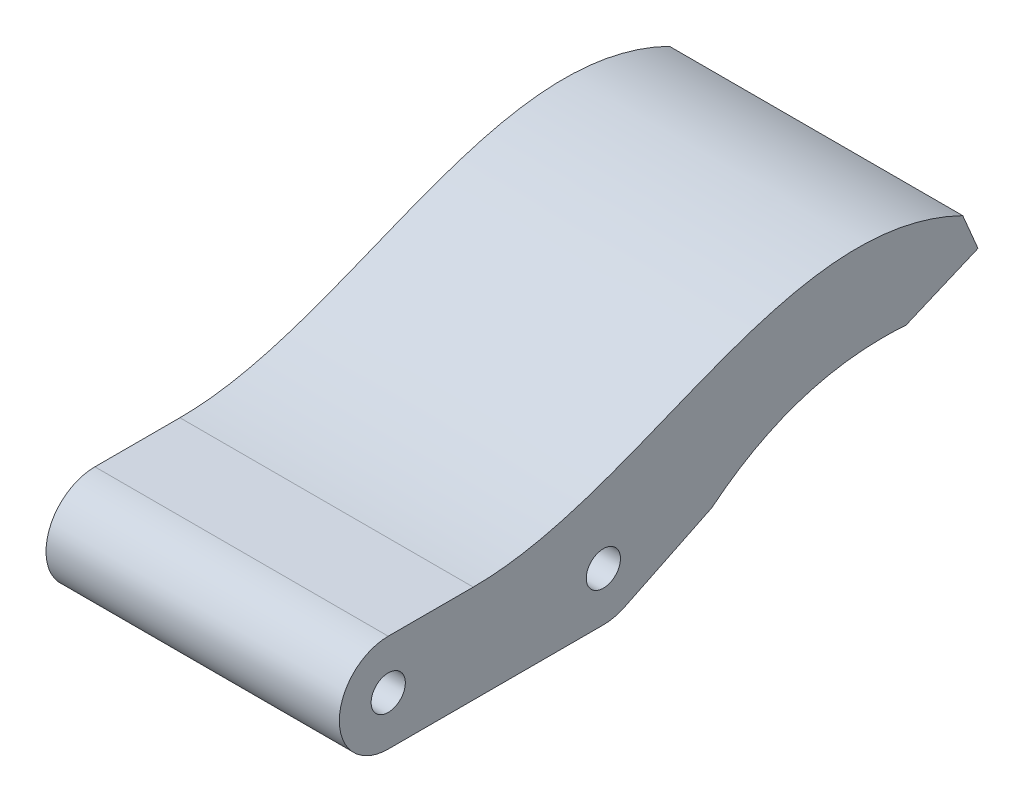
ISO-10303-21;
HEADER;
FILE_DESCRIPTION(('STEP AP214'),'2;1');
FILE_NAME('part.step','',(''),(''),'','','');
FILE_SCHEMA(('AUTOMOTIVE_DESIGN { 1 0 10303 214 1 1 1 1 }'));
ENDSEC;
DATA;
#1=APPLICATION_CONTEXT('core data for automotive mechanical design processes');
#2=APPLICATION_PROTOCOL_DEFINITION('international standard','automotive_design',2000,#1);
#3=PRODUCT_CONTEXT('',#1,'mechanical');
#4=PRODUCT('Part','Part','',(#3));
#5=PRODUCT_RELATED_PRODUCT_CATEGORY('part','',(#4));
#6=PRODUCT_DEFINITION_FORMATION('','',#4);
#7=PRODUCT_DEFINITION_CONTEXT('part definition',#1,'design');
#8=PRODUCT_DEFINITION('design','',#6,#7);
#9=PRODUCT_DEFINITION_SHAPE('','',#8);
#10=(LENGTH_UNIT() NAMED_UNIT(*) SI_UNIT(.MILLI.,.METRE.));
#11=(NAMED_UNIT(*) PLANE_ANGLE_UNIT() SI_UNIT($,.RADIAN.));
#12=(NAMED_UNIT(*) SI_UNIT($,.STERADIAN.) SOLID_ANGLE_UNIT());
#13=UNCERTAINTY_MEASURE_WITH_UNIT(LENGTH_MEASURE(1.E-05),#10,'distance_accuracy_value','');
#14=(GEOMETRIC_REPRESENTATION_CONTEXT(3) GLOBAL_UNCERTAINTY_ASSIGNED_CONTEXT((#13)) GLOBAL_UNIT_ASSIGNED_CONTEXT((#10,
#11,#12)) REPRESENTATION_CONTEXT('',''));
#15=CARTESIAN_POINT('',(0.,0.,0.));
#16=DIRECTION('',(0.,0.,1.));
#17=DIRECTION('',(1.,0.,0.));
#18=AXIS2_PLACEMENT_3D('',#15,#16,#17);
#19=CARTESIAN_POINT('',(30.,5.,-27.));
#20=DIRECTION('',(-1.,0.,0.));
#21=DIRECTION('',(0.,0.,1.));
#22=AXIS2_PLACEMENT_3D('',#19,#20,#21);
#23=CYLINDRICAL_SURFACE('',#22,5.);
#24=DIRECTION('',(1.,0.,0.));
#25=VECTOR('',#24,1.);
#26=CARTESIAN_POINT('',(-56.0007840593189,0.502127655445501,-29.1838370754458));
#27=LINE('',#26,#25);
#28=CARTESIAN_POINT('',(0.,0.502127655445501,-29.1838370754458));
#29=VERTEX_POINT('',#28);
#30=CARTESIAN_POINT('',(30.,0.502127655445501,-29.1838370754458));
#31=VERTEX_POINT('',#30);
#32=EDGE_CURVE('E170',#29,#31,#27,.T.);
#33=ORIENTED_EDGE('',*,*,#32,.T.);
#34=CARTESIAN_POINT('',(30.,5.,-27.));
#35=DIRECTION('',(1.,0.,0.));
#36=DIRECTION('',(0.,0.,-1.));
#37=AXIS2_PLACEMENT_3D('',#34,#35,#36);
#38=CIRCLE('',#37,5.);
#39=CARTESIAN_POINT('',(30.,0.,-27.));
#40=VERTEX_POINT('',#39);
#41=EDGE_CURVE('E188',#40,#31,#38,.T.);
#42=ORIENTED_EDGE('',*,*,#41,.F.);
#43=DIRECTION('',(-1.,0.,0.));
#44=VECTOR('',#43,1.);
#45=CARTESIAN_POINT('',(30.,0.,-27.));
#46=LINE('',#45,#44);
#47=CARTESIAN_POINT('',(0.,0.,-27.));
#48=VERTEX_POINT('',#47);
#49=EDGE_CURVE('E196',#40,#48,#46,.T.);
#50=ORIENTED_EDGE('',*,*,#49,.T.);
#51=CARTESIAN_POINT('',(0.,5.,-27.));
#52=DIRECTION('',(1.,0.,0.));
#53=DIRECTION('',(0.,0.,-1.));
#54=AXIS2_PLACEMENT_3D('',#51,#52,#53);
#55=CIRCLE('',#54,5.);
#56=EDGE_CURVE('E201',#48,#29,#55,.T.);
#57=ORIENTED_EDGE('',*,*,#56,.T.);
#58=EDGE_LOOP('',(#33,#42,#50,#57));
#59=FACE_BOUND('',#58,.T.);
#60=ADVANCED_FACE('F37',(#59),#23,.T.);
#61=CARTESIAN_POINT('',(30.,10.,0.));
#62=DIRECTION('',(0.,1.,0.));
#63=DIRECTION('',(0.,0.,1.));
#64=AXIS2_PLACEMENT_3D('',#61,#62,#63);
#65=PLANE('',#64);
#66=DIRECTION('',(1.,0.,0.));
#67=VECTOR('',#66,1.);
#68=CARTESIAN_POINT('',(-56.0007840593189,10.,-13.6949747586838));
#69=LINE('',#68,#67);
#70=CARTESIAN_POINT('',(0.,10.,-13.6949747586838));
#71=VERTEX_POINT('',#70);
#72=CARTESIAN_POINT('',(30.,10.,-13.6949747586838));
#73=VERTEX_POINT('',#72);
#74=EDGE_CURVE('E127',#71,#73,#69,.T.);
#75=ORIENTED_EDGE('',*,*,#74,.F.);
#76=DIRECTION('',(0.,0.,-1.));
#77=VECTOR('',#76,1.);
#78=CARTESIAN_POINT('',(0.,10.,0.));
#79=LINE('',#78,#77);
#80=CARTESIAN_POINT('',(0.,10.,-5.));
#81=VERTEX_POINT('',#80);
#82=EDGE_CURVE('E178',#81,#71,#79,.T.);
#83=ORIENTED_EDGE('',*,*,#82,.F.);
#84=DIRECTION('',(-1.,0.,0.));
#85=VECTOR('',#84,1.);
#86=CARTESIAN_POINT('',(30.,10.,-5.));
#87=LINE('',#86,#85);
#88=CARTESIAN_POINT('',(30.,10.,-5.));
#89=VERTEX_POINT('',#88);
#90=EDGE_CURVE('E11',#89,#81,#87,.T.);
#91=ORIENTED_EDGE('',*,*,#90,.F.);
#92=DIRECTION('',(0.,0.,-1.));
#93=VECTOR('',#92,1.);
#94=CARTESIAN_POINT('',(30.,10.,0.));
#95=LINE('',#94,#93);
#96=EDGE_CURVE('E179',#89,#73,#95,.T.);
#97=ORIENTED_EDGE('',*,*,#96,.T.);
#98=EDGE_LOOP('',(#75,#83,#91,#97));
#99=FACE_BOUND('',#98,.T.);
#100=ADVANCED_FACE('F39',(#99),#65,.T.);
#101=CARTESIAN_POINT('',(30.,5.,-5.));
#102=DIRECTION('',(-1.,0.,0.));
#103=DIRECTION('',(0.,0.,1.));
#104=AXIS2_PLACEMENT_3D('',#101,#102,#103);
#105=CYLINDRICAL_SURFACE('',#104,5.);
#106=CARTESIAN_POINT('',(0.,5.,-5.));
#107=DIRECTION('',(1.,0.,0.));
#108=DIRECTION('',(0.,0.,-1.));
#109=AXIS2_PLACEMENT_3D('',#106,#107,#108);
#110=CIRCLE('',#109,5.);
#111=CARTESIAN_POINT('',(0.,0.,-5.));
#112=VERTEX_POINT('',#111);
#113=EDGE_CURVE('E67',#81,#112,#110,.T.);
#114=ORIENTED_EDGE('',*,*,#113,.T.);
#115=DIRECTION('',(-1.,0.,0.));
#116=VECTOR('',#115,1.);
#117=CARTESIAN_POINT('',(30.,0.,-5.));
#118=LINE('',#117,#116);
#119=CARTESIAN_POINT('',(30.,0.,-5.));
#120=VERTEX_POINT('',#119);
#121=EDGE_CURVE('E46',#120,#112,#118,.T.);
#122=ORIENTED_EDGE('',*,*,#121,.F.);
#123=CARTESIAN_POINT('',(30.,5.,-5.));
#124=DIRECTION('',(1.,0.,0.));
#125=DIRECTION('',(0.,0.,-1.));
#126=AXIS2_PLACEMENT_3D('',#123,#124,#125);
#127=CIRCLE('',#126,5.);
#128=EDGE_CURVE('E184',#89,#120,#127,.T.);
#129=ORIENTED_EDGE('',*,*,#128,.F.);
#130=ORIENTED_EDGE('',*,*,#90,.T.);
#131=EDGE_LOOP('',(#114,#122,#129,#130));
#132=FACE_BOUND('',#131,.T.);
#133=ADVANCED_FACE('F265',(#132),#105,.T.);
#134=CARTESIAN_POINT('',(30.,0.,0.));
#135=DIRECTION('',(0.,1.,0.));
#136=DIRECTION('',(0.,0.,1.));
#137=AXIS2_PLACEMENT_3D('',#134,#135,#136);
#138=PLANE('',#137);
#139=DIRECTION('',(0.,0.,-1.));
#140=VECTOR('',#139,1.);
#141=CARTESIAN_POINT('',(0.,0.,0.));
#142=LINE('',#141,#140);
#143=EDGE_CURVE('E72',#112,#48,#142,.T.);
#144=ORIENTED_EDGE('',*,*,#143,.T.);
#145=ORIENTED_EDGE('',*,*,#49,.F.);
#146=DIRECTION('',(0.,0.,-1.));
#147=VECTOR('',#146,1.);
#148=CARTESIAN_POINT('',(30.,0.,0.));
#149=LINE('',#148,#147);
#150=EDGE_CURVE('E54',#120,#40,#149,.T.);
#151=ORIENTED_EDGE('',*,*,#150,.F.);
#152=ORIENTED_EDGE('',*,*,#121,.T.);
#153=EDGE_LOOP('',(#144,#145,#151,#152));
#154=FACE_BOUND('',#153,.T.);
#155=ADVANCED_FACE('F209',(#154),#138,.F.);
#156=CARTESIAN_POINT('',(30.,5.,-5.));
#157=DIRECTION('',(-1.,0.,0.));
#158=DIRECTION('',(0.,0.,1.));
#159=AXIS2_PLACEMENT_3D('',#156,#157,#158);
#160=CYLINDRICAL_SURFACE('',#159,1.75);
#161=CARTESIAN_POINT('',(30.,5.,-5.));
#162=DIRECTION('',(1.,0.,0.));
#163=DIRECTION('',(0.,0.,-1.));
#164=AXIS2_PLACEMENT_3D('',#161,#162,#163);
#165=CIRCLE('',#164,1.75);
#166=CARTESIAN_POINT('',(30.,5.,-6.75));
#167=VERTEX_POINT('',#166);
#168=EDGE_CURVE('E190',#167,#167,#165,.T.);
#169=ORIENTED_EDGE('',*,*,#168,.T.);
#170=EDGE_LOOP('',(#169));
#171=FACE_BOUND('',#170,.T.);
#172=CARTESIAN_POINT('',(0.,5.,-5.));
#173=DIRECTION('',(1.,0.,0.));
#174=DIRECTION('',(0.,0.,-1.));
#175=AXIS2_PLACEMENT_3D('',#172,#173,#174);
#176=CIRCLE('',#175,1.75);
#177=CARTESIAN_POINT('',(0.,5.,-6.75));
#178=VERTEX_POINT('',#177);
#179=EDGE_CURVE('E204',#178,#178,#176,.T.);
#180=ORIENTED_EDGE('',*,*,#179,.F.);
#181=EDGE_LOOP('',(#180));
#182=FACE_BOUND('',#181,.T.);
#183=ADVANCED_FACE('F257',(#171,#182),#160,.F.);
#184=CARTESIAN_POINT('',(30.,5.,-27.));
#185=DIRECTION('',(-1.,0.,0.));
#186=DIRECTION('',(0.,0.,1.));
#187=AXIS2_PLACEMENT_3D('',#184,#185,#186);
#188=CYLINDRICAL_SURFACE('',#187,1.75);
#189=CARTESIAN_POINT('',(30.,5.,-27.));
#190=DIRECTION('',(1.,0.,0.));
#191=DIRECTION('',(0.,0.,-1.));
#192=AXIS2_PLACEMENT_3D('',#189,#190,#191);
#193=CIRCLE('',#192,1.75);
#194=CARTESIAN_POINT('',(30.,5.,-28.75));
#195=VERTEX_POINT('',#194);
#196=EDGE_CURVE('E193',#195,#195,#193,.T.);
#197=ORIENTED_EDGE('',*,*,#196,.T.);
#198=EDGE_LOOP('',(#197));
#199=FACE_BOUND('',#198,.T.);
#200=CARTESIAN_POINT('',(0.,5.,-27.));
#201=DIRECTION('',(1.,0.,0.));
#202=DIRECTION('',(0.,0.,-1.));
#203=AXIS2_PLACEMENT_3D('',#200,#201,#202);
#204=CIRCLE('',#203,1.75);
#205=CARTESIAN_POINT('',(0.,5.,-28.75));
#206=VERTEX_POINT('',#205);
#207=EDGE_CURVE('E185',#206,#206,#204,.T.);
#208=ORIENTED_EDGE('',*,*,#207,.F.);
#209=EDGE_LOOP('',(#208));
#210=FACE_BOUND('',#209,.T.);
#211=ADVANCED_FACE('F252',(#199,#210),#188,.F.);
#212=CARTESIAN_POINT('',(30.,0.,0.));
#213=DIRECTION('',(1.,0.,0.));
#214=DIRECTION('',(0.,0.,-1.));
#215=AXIS2_PLACEMENT_3D('',#212,#213,#214);
#216=PLANE('',#215);
#217=ORIENTED_EDGE('',*,*,#96,.F.);
#218=ORIENTED_EDGE('',*,*,#128,.T.);
#219=ORIENTED_EDGE('',*,*,#150,.T.);
#220=ORIENTED_EDGE('',*,*,#41,.T.);
#221=DIRECTION('',(0.,0.436767415089167,-0.8995744689109));
#222=VECTOR('',#221,1.);
#223=CARTESIAN_POINT('',(30.,-11.0601312365663,-5.36998891997289));
#224=LINE('',#223,#222);
#225=CARTESIAN_POINT('',(30.,4.82408407678908,-38.0854206599091));
#226=VERTEX_POINT('',#225);
#227=EDGE_CURVE('E135',#31,#226,#224,.T.);
#228=ORIENTED_EDGE('',*,*,#227,.T.);
#229=CARTESIAN_POINT('',(30.,4.82408407678908,-38.0854206599091));
#230=CARTESIAN_POINT('',(30.,11.8952224566425,-46.7975095094647));
#231=CARTESIAN_POINT('',(30.,11.0678436667493,-57.9480004086976));
#232=B_SPLINE_CURVE_WITH_KNOTS('',2,(#229,#230,#231),.UNSPECIFIED.,.F.,.F.,(3,3),(0.,1.),.UNSPECIFIED.);
#233=CARTESIAN_POINT('',(30.,11.0678436667493,-57.9480004086976));
#234=VERTEX_POINT('',#233);
#235=EDGE_CURVE('E155',#226,#234,#232,.T.);
#236=ORIENTED_EDGE('',*,*,#235,.T.);
#237=DIRECTION('',(0.,0.39020935118337,-0.920726160293631));
#238=VECTOR('',#237,1.);
#239=CARTESIAN_POINT('',(30.,-11.4367064909869,-4.84694582599828));
#240=LINE('',#239,#238);
#241=CARTESIAN_POINT('',(30.,14.1895184762162,-65.3138096910467));
#242=VERTEX_POINT('',#241);
#243=EDGE_CURVE('E128',#234,#242,#240,.T.);
#244=ORIENTED_EDGE('',*,*,#243,.T.);
#245=DIRECTION('',(0.,0.920726160293631,0.39020935118337));
#246=VECTOR('',#245,1.);
#247=CARTESIAN_POINT('',(30.,25.6262249672031,-60.4668638650484));
#248=LINE('',#247,#246);
#249=CARTESIAN_POINT('',(30.,17.8724231173908,-63.7529722863132));
#250=VERTEX_POINT('',#249);
#251=EDGE_CURVE('E123',#242,#250,#248,.T.);
#252=ORIENTED_EDGE('',*,*,#251,.T.);
#253=CARTESIAN_POINT('',(30.,17.8724231173908,-63.7529722863132));
#254=CARTESIAN_POINT('',(30.,26.563787962677,-45.9288826779558));
#255=CARTESIAN_POINT('',(30.,10.,-31.059268620705));
#256=CARTESIAN_POINT('',(30.,10.,-13.6949747586838));
#257=B_SPLINE_CURVE_WITH_KNOTS('',3,(#253,#254,#255,#256),.UNSPECIFIED.,.F.,.F.,(4,4),(0.,1.),.UNSPECIFIED.);
#258=EDGE_CURVE('E131',#250,#73,#257,.T.);
#259=ORIENTED_EDGE('',*,*,#258,.T.);
#260=EDGE_LOOP('',(#217,#218,#219,#220,#228,#236,#244,#252,#259));
#261=FACE_BOUND('',#260,.T.);
#262=ORIENTED_EDGE('',*,*,#168,.F.);
#263=EDGE_LOOP('',(#262));
#264=FACE_BOUND('',#263,.T.);
#265=ORIENTED_EDGE('',*,*,#196,.F.);
#266=EDGE_LOOP('',(#265));
#267=FACE_BOUND('',#266,.T.);
#268=ADVANCED_FACE('F137',(#261,#264,#267),#216,.T.);
#269=CARTESIAN_POINT('',(0.,0.,0.));
#270=DIRECTION('',(1.,0.,0.));
#271=DIRECTION('',(0.,0.,-1.));
#272=AXIS2_PLACEMENT_3D('',#269,#270,#271);
#273=PLANE('',#272);
#274=DIRECTION('',(0.,-0.436767415089167,0.8995744689109));
#275=VECTOR('',#274,1.);
#276=CARTESIAN_POINT('',(0.,-11.0601312365663,-5.36998891997289));
#277=LINE('',#276,#275);
#278=CARTESIAN_POINT('',(0.,4.82408407678908,-38.0854206599091));
#279=VERTEX_POINT('',#278);
#280=EDGE_CURVE('E165',#279,#29,#277,.T.);
#281=ORIENTED_EDGE('',*,*,#280,.T.);
#282=ORIENTED_EDGE('',*,*,#56,.F.);
#283=ORIENTED_EDGE('',*,*,#143,.F.);
#284=ORIENTED_EDGE('',*,*,#113,.F.);
#285=ORIENTED_EDGE('',*,*,#82,.T.);
#286=CARTESIAN_POINT('',(0.,17.8724231173908,-63.7529722863132));
#287=CARTESIAN_POINT('',(0.,26.563787962677,-45.9288826779558));
#288=CARTESIAN_POINT('',(0.,10.,-31.059268620705));
#289=CARTESIAN_POINT('',(0.,10.,-13.6949747586838));
#290=B_SPLINE_CURVE_WITH_KNOTS('',3,(#286,#287,#288,#289),.UNSPECIFIED.,.F.,.F.,(4,4),(0.,1.),.UNSPECIFIED.);
#291=CARTESIAN_POINT('',(0.,17.8724231173908,-63.7529722863132));
#292=VERTEX_POINT('',#291);
#293=EDGE_CURVE('E174',#71,#292,#290,.F.);
#294=ORIENTED_EDGE('',*,*,#293,.T.);
#295=DIRECTION('',(0.,-0.920726160293632,-0.39020935118337));
#296=VECTOR('',#295,1.);
#297=CARTESIAN_POINT('',(0.,25.6262249672031,-60.4668638650484));
#298=LINE('',#297,#296);
#299=CARTESIAN_POINT('',(0.,14.1895184762162,-65.3138096910467));
#300=VERTEX_POINT('',#299);
#301=EDGE_CURVE('E125',#292,#300,#298,.T.);
#302=ORIENTED_EDGE('',*,*,#301,.T.);
#303=DIRECTION('',(0.,-0.39020935118337,0.920726160293631));
#304=VECTOR('',#303,1.);
#305=CARTESIAN_POINT('',(0.,-11.4367064909869,-4.84694582599828));
#306=LINE('',#305,#304);
#307=CARTESIAN_POINT('',(0.,11.0678436667493,-57.9480004086976));
#308=VERTEX_POINT('',#307);
#309=EDGE_CURVE('E230',#300,#308,#306,.T.);
#310=ORIENTED_EDGE('',*,*,#309,.T.);
#311=CARTESIAN_POINT('',(0.,4.82408407678908,-38.0854206599091));
#312=CARTESIAN_POINT('',(0.,11.8952224566425,-46.7975095094647));
#313=CARTESIAN_POINT('',(0.,11.0678436667493,-57.9480004086976));
#314=B_SPLINE_CURVE_WITH_KNOTS('',2,(#311,#312,#313),.UNSPECIFIED.,.F.,.F.,(3,3),(0.,1.),.UNSPECIFIED.);
#315=EDGE_CURVE('E226',#308,#279,#314,.F.);
#316=ORIENTED_EDGE('',*,*,#315,.T.);
#317=EDGE_LOOP('',(#281,#282,#283,#284,#285,#294,#302,#310,#316));
#318=FACE_BOUND('',#317,.T.);
#319=ORIENTED_EDGE('',*,*,#179,.T.);
#320=EDGE_LOOP('',(#319));
#321=FACE_BOUND('',#320,.T.);
#322=ORIENTED_EDGE('',*,*,#207,.T.);
#323=EDGE_LOOP('',(#322));
#324=FACE_BOUND('',#323,.T.);
#325=ADVANCED_FACE('F212',(#318,#321,#324),#273,.F.);
#326=CARTESIAN_POINT('',(-56.0007840593189,25.6262249672031,-60.4668638650484));
#327=DIRECTION('',(0.,0.39020935118337,-0.920726160293631));
#328=DIRECTION('',(0.,0.920726160293632,0.39020935118337));
#329=AXIS2_PLACEMENT_3D('',#326,#327,#328);
#330=PLANE('',#329);
#331=ORIENTED_EDGE('',*,*,#301,.F.);
#332=DIRECTION('',(1.,0.,0.));
#333=VECTOR('',#332,1.);
#334=CARTESIAN_POINT('',(-56.0007840593189,17.8724231173908,-63.7529722863132));
#335=LINE('',#334,#333);
#336=EDGE_CURVE('E118',#292,#250,#335,.T.);
#337=ORIENTED_EDGE('',*,*,#336,.T.);
#338=ORIENTED_EDGE('',*,*,#251,.F.);
#339=DIRECTION('',(1.,0.,0.));
#340=VECTOR('',#339,1.);
#341=CARTESIAN_POINT('',(-56.0007840593189,14.1895184762162,-65.3138096910467));
#342=LINE('',#341,#340);
#343=EDGE_CURVE('E163',#300,#242,#342,.T.);
#344=ORIENTED_EDGE('',*,*,#343,.F.);
#345=EDGE_LOOP('',(#331,#337,#338,#344));
#346=FACE_BOUND('',#345,.T.);
#347=ADVANCED_FACE('F120',(#346),#330,.T.);
#348=CARTESIAN_POINT('',(-56.0007840593189,-11.4367064909869,-4.84694582599828));
#349=DIRECTION('',(0.,-0.920726160293631,-0.39020935118337));
#350=DIRECTION('',(0.,0.39020935118337,-0.920726160293631));
#351=AXIS2_PLACEMENT_3D('',#348,#349,#350);
#352=PLANE('',#351);
#353=ORIENTED_EDGE('',*,*,#309,.F.);
#354=ORIENTED_EDGE('',*,*,#343,.T.);
#355=ORIENTED_EDGE('',*,*,#243,.F.);
#356=DIRECTION('',(1.,0.,0.));
#357=VECTOR('',#356,1.);
#358=CARTESIAN_POINT('',(-56.0007840593189,11.0678436667493,-57.9480004086976));
#359=LINE('',#358,#357);
#360=EDGE_CURVE('E166',#308,#234,#359,.T.);
#361=ORIENTED_EDGE('',*,*,#360,.F.);
#362=EDGE_LOOP('',(#353,#354,#355,#361));
#363=FACE_BOUND('',#362,.T.);
#364=ADVANCED_FACE('F229',(#363),#352,.T.);
#365=CARTESIAN_POINT('',(-56.0007840593189,4.82408407678908,-38.0854206599091));
#366=CARTESIAN_POINT('',(-56.0007840593189,11.8952224566425,-46.7975095094647));
#367=CARTESIAN_POINT('',(-56.0007840593189,11.0678436667493,-57.9480004086976));
#368=B_SPLINE_CURVE_WITH_KNOTS('',2,(#365,#366,#367),.UNSPECIFIED.,.F.,.F.,(3,3),(0.,1.),.UNSPECIFIED.);
#369=DIRECTION('',(1.,0.,0.));
#370=VECTOR('',#369,1.);
#371=SURFACE_OF_LINEAR_EXTRUSION('',#368,#370);
#372=ORIENTED_EDGE('',*,*,#315,.F.);
#373=ORIENTED_EDGE('',*,*,#360,.T.);
#374=ORIENTED_EDGE('',*,*,#235,.F.);
#375=DIRECTION('',(1.,0.,0.));
#376=VECTOR('',#375,1.);
#377=CARTESIAN_POINT('',(-56.0007840593189,4.82408407678908,-38.0854206599091));
#378=LINE('',#377,#376);
#379=EDGE_CURVE('E168',#279,#226,#378,.T.);
#380=ORIENTED_EDGE('',*,*,#379,.F.);
#381=EDGE_LOOP('',(#372,#373,#374,#380));
#382=FACE_BOUND('',#381,.T.);
#383=ADVANCED_FACE('F224',(#382),#371,.T.);
#384=CARTESIAN_POINT('',(-56.0007840593189,-11.0601312365663,-5.36998891997289));
#385=DIRECTION('',(0.,-0.8995744689109,-0.436767415089167));
#386=DIRECTION('',(0.,0.436767415089167,-0.8995744689109));
#387=AXIS2_PLACEMENT_3D('',#384,#385,#386);
#388=PLANE('',#387);
#389=ORIENTED_EDGE('',*,*,#280,.F.);
#390=ORIENTED_EDGE('',*,*,#379,.T.);
#391=ORIENTED_EDGE('',*,*,#227,.F.);
#392=ORIENTED_EDGE('',*,*,#32,.F.);
#393=EDGE_LOOP('',(#389,#390,#391,#392));
#394=FACE_BOUND('',#393,.T.);
#395=ADVANCED_FACE('F220',(#394),#388,.T.);
#396=CARTESIAN_POINT('',(-56.0007840593189,17.8724231173908,-63.7529722863132));
#397=CARTESIAN_POINT('',(-56.0007840593189,26.563787962677,-45.9288826779558));
#398=CARTESIAN_POINT('',(-56.0007840593189,10.,-31.059268620705));
#399=CARTESIAN_POINT('',(-56.0007840593189,10.,-13.6949747586838));
#400=B_SPLINE_CURVE_WITH_KNOTS('',3,(#396,#397,#398,#399),.UNSPECIFIED.,.F.,.F.,(4,4),(0.,1.),.UNSPECIFIED.);
#401=DIRECTION('',(1.,0.,0.));
#402=VECTOR('',#401,1.);
#403=SURFACE_OF_LINEAR_EXTRUSION('',#400,#402);
#404=ORIENTED_EDGE('',*,*,#293,.F.);
#405=ORIENTED_EDGE('',*,*,#74,.T.);
#406=ORIENTED_EDGE('',*,*,#258,.F.);
#407=ORIENTED_EDGE('',*,*,#336,.F.);
#408=EDGE_LOOP('',(#404,#405,#406,#407));
#409=FACE_BOUND('',#408,.T.);
#410=ADVANCED_FACE('F132',(#409),#403,.T.);
#411=CLOSED_SHELL('',(#60,#100,#133,#155,#183,#211,#268,#325,#347,#364,#383,#395,#410));
#412=MANIFOLD_SOLID_BREP('B2',#411);
#413=ADVANCED_BREP_SHAPE_REPRESENTATION('',(#18,#412),#14);
#414=SHAPE_DEFINITION_REPRESENTATION(#9,#413);
ENDSEC;
END-ISO-10303-21;
